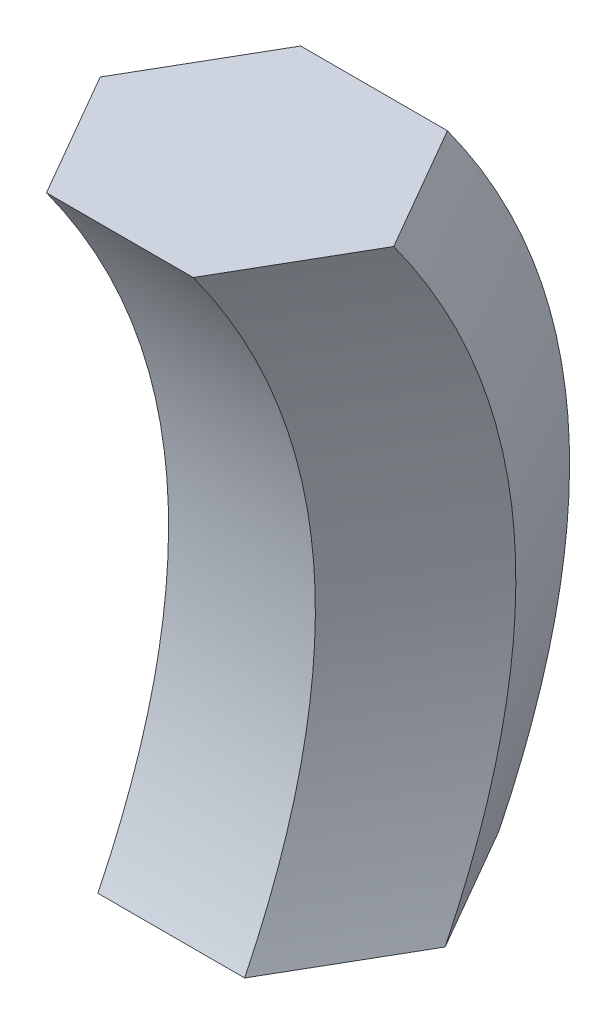
ISO-10303-21;
HEADER;
FILE_DESCRIPTION(('STEP AP214'),'2;1');
FILE_NAME('part.step','',(''),(''),'','','');
FILE_SCHEMA(('AUTOMOTIVE_DESIGN { 1 0 10303 214 1 1 1 1 }'));
ENDSEC;
DATA;
#1=APPLICATION_CONTEXT('core data for automotive mechanical design processes');
#2=APPLICATION_PROTOCOL_DEFINITION('international standard','automotive_design',2000,#1);
#3=PRODUCT_CONTEXT('',#1,'mechanical');
#4=PRODUCT('Part','Part','',(#3));
#5=PRODUCT_RELATED_PRODUCT_CATEGORY('part','',(#4));
#6=PRODUCT_DEFINITION_FORMATION('','',#4);
#7=PRODUCT_DEFINITION_CONTEXT('part definition',#1,'design');
#8=PRODUCT_DEFINITION('design','',#6,#7);
#9=PRODUCT_DEFINITION_SHAPE('','',#8);
#10=(LENGTH_UNIT() NAMED_UNIT(*) SI_UNIT(.MILLI.,.METRE.));
#11=(NAMED_UNIT(*) PLANE_ANGLE_UNIT() SI_UNIT($,.RADIAN.));
#12=(NAMED_UNIT(*) SI_UNIT($,.STERADIAN.) SOLID_ANGLE_UNIT());
#13=UNCERTAINTY_MEASURE_WITH_UNIT(LENGTH_MEASURE(1.E-05),#10,'distance_accuracy_value','');
#14=(GEOMETRIC_REPRESENTATION_CONTEXT(3) GLOBAL_UNCERTAINTY_ASSIGNED_CONTEXT((#13)) GLOBAL_UNIT_ASSIGNED_CONTEXT((#10,
#11,#12)) REPRESENTATION_CONTEXT('',''));
#15=CARTESIAN_POINT('',(0.,0.,0.));
#16=DIRECTION('',(0.,0.,1.));
#17=DIRECTION('',(1.,0.,0.));
#18=AXIS2_PLACEMENT_3D('',#15,#16,#17);
#19=CARTESIAN_POINT('',(0.,100.,0.));
#20=DIRECTION('',(0.,1.,0.));
#21=DIRECTION('',(0.,0.,1.));
#22=AXIS2_PLACEMENT_3D('',#19,#20,#21);
#23=PLANE('',#22);
#24=DIRECTION('',(0.5,0.,-0.866025403784439));
#25=VECTOR('',#24,1.);
#26=CARTESIAN_POINT('',(11.6047404107115,100.,28.2321956119478));
#27=LINE('',#26,#25);
#28=CARTESIAN_POINT('',(11.6047404107115,100.,28.2321956119478));
#29=VERTEX_POINT('',#28);
#30=CARTESIAN_POINT('',(23.2094808214229,100.,8.13219561194784));
#31=VERTEX_POINT('',#30);
#32=EDGE_CURVE('E504',#29,#31,#27,.T.);
#33=ORIENTED_EDGE('',*,*,#32,.T.);
#34=DIRECTION('',(-0.5,0.,-0.866025403784439));
#35=VECTOR('',#34,1.);
#36=CARTESIAN_POINT('',(23.2094808214229,100.,8.13219561194784));
#37=LINE('',#36,#35);
#38=CARTESIAN_POINT('',(11.6047404107115,100.,-11.9678043880522));
#39=VERTEX_POINT('',#38);
#40=EDGE_CURVE('E228',#31,#39,#37,.T.);
#41=ORIENTED_EDGE('',*,*,#40,.T.);
#42=DIRECTION('',(-1.,0.,0.));
#43=VECTOR('',#42,1.);
#44=CARTESIAN_POINT('',(11.6047404107115,100.,-11.9678043880522));
#45=LINE('',#44,#43);
#46=CARTESIAN_POINT('',(-11.6047404107115,100.,-11.9678043880522));
#47=VERTEX_POINT('',#46);
#48=EDGE_CURVE('E287',#39,#47,#45,.T.);
#49=ORIENTED_EDGE('',*,*,#48,.T.);
#50=DIRECTION('',(-0.5,0.,0.866025403784439));
#51=VECTOR('',#50,1.);
#52=CARTESIAN_POINT('',(-11.6047404107115,100.,-11.9678043880522));
#53=LINE('',#52,#51);
#54=CARTESIAN_POINT('',(-23.209480821423,100.,8.13219561194783));
#55=VERTEX_POINT('',#54);
#56=EDGE_CURVE('E301',#47,#55,#53,.T.);
#57=ORIENTED_EDGE('',*,*,#56,.T.);
#58=DIRECTION('',(0.5,0.,0.866025403784439));
#59=VECTOR('',#58,1.);
#60=CARTESIAN_POINT('',(-23.209480821423,100.,8.13219561194783));
#61=LINE('',#60,#59);
#62=CARTESIAN_POINT('',(-11.6047404107115,100.,28.2321956119478));
#63=VERTEX_POINT('',#62);
#64=EDGE_CURVE('E151',#55,#63,#61,.T.);
#65=ORIENTED_EDGE('',*,*,#64,.T.);
#66=DIRECTION('',(1.,0.,0.));
#67=VECTOR('',#66,1.);
#68=CARTESIAN_POINT('',(-11.6047404107115,100.,28.2321956119478));
#69=LINE('',#68,#67);
#70=EDGE_CURVE('E13',#63,#29,#69,.T.);
#71=ORIENTED_EDGE('',*,*,#70,.T.);
#72=EDGE_LOOP('',(#33,#41,#49,#57,#65,#71));
#73=FACE_BOUND('',#72,.T.);
#74=ADVANCED_FACE('F141',(#73),#23,.T.);
#75=CARTESIAN_POINT('',(0.,0.,0.));
#76=DIRECTION('',(0.,1.,0.));
#77=DIRECTION('',(0.,0.,1.));
#78=AXIS2_PLACEMENT_3D('',#75,#76,#77);
#79=PLANE('',#78);
#80=DIRECTION('',(0.5,0.,-0.866025403784439));
#81=VECTOR('',#80,1.);
#82=CARTESIAN_POINT('',(11.6047404107115,0.,20.1));
#83=LINE('',#82,#81);
#84=CARTESIAN_POINT('',(11.6047404107115,0.,20.1));
#85=VERTEX_POINT('',#84);
#86=CARTESIAN_POINT('',(23.209480821423,0.,0.));
#87=VERTEX_POINT('',#86);
#88=EDGE_CURVE('E202',#85,#87,#83,.T.);
#89=ORIENTED_EDGE('',*,*,#88,.F.);
#90=DIRECTION('',(1.,0.,0.));
#91=VECTOR('',#90,1.);
#92=CARTESIAN_POINT('',(-11.6047404107115,0.,20.1));
#93=LINE('',#92,#91);
#94=CARTESIAN_POINT('',(-11.6047404107115,0.,20.1));
#95=VERTEX_POINT('',#94);
#96=EDGE_CURVE('E344',#95,#85,#93,.T.);
#97=ORIENTED_EDGE('',*,*,#96,.F.);
#98=DIRECTION('',(0.5,0.,0.866025403784439));
#99=VECTOR('',#98,1.);
#100=CARTESIAN_POINT('',(-23.209480821423,0.,0.));
#101=LINE('',#100,#99);
#102=CARTESIAN_POINT('',(-23.209480821423,0.,0.));
#103=VERTEX_POINT('',#102);
#104=EDGE_CURVE('E354',#103,#95,#101,.T.);
#105=ORIENTED_EDGE('',*,*,#104,.F.);
#106=DIRECTION('',(-0.5,0.,0.866025403784439));
#107=VECTOR('',#106,1.);
#108=CARTESIAN_POINT('',(-11.6047404107115,0.,-20.1));
#109=LINE('',#108,#107);
#110=CARTESIAN_POINT('',(-11.6047404107115,0.,-20.1));
#111=VERTEX_POINT('',#110);
#112=EDGE_CURVE('E409',#111,#103,#109,.T.);
#113=ORIENTED_EDGE('',*,*,#112,.F.);
#114=DIRECTION('',(-1.,0.,0.));
#115=VECTOR('',#114,1.);
#116=CARTESIAN_POINT('',(11.6047404107115,0.,-20.1));
#117=LINE('',#116,#115);
#118=CARTESIAN_POINT('',(11.6047404107115,0.,-20.1));
#119=VERTEX_POINT('',#118);
#120=EDGE_CURVE('E205',#119,#111,#117,.T.);
#121=ORIENTED_EDGE('',*,*,#120,.F.);
#122=DIRECTION('',(-0.5,0.,-0.866025403784439));
#123=VECTOR('',#122,1.);
#124=CARTESIAN_POINT('',(23.209480821423,0.,0.));
#125=LINE('',#124,#123);
#126=EDGE_CURVE('E198',#87,#119,#125,.T.);
#127=ORIENTED_EDGE('',*,*,#126,.F.);
#128=EDGE_LOOP('',(#89,#97,#105,#113,#121,#127));
#129=FACE_BOUND('',#128,.T.);
#130=ADVANCED_FACE('F201',(#129),#79,.F.);
#131=CARTESIAN_POINT('',(11.6047404107115,0.,-20.1));
#132=CARTESIAN_POINT('',(11.6047404107112,35.3808590582085,-37.349024663102));
#133=CARTESIAN_POINT('',(11.6047404107112,68.7141923915418,-34.6382927924527));
#134=CARTESIAN_POINT('',(11.6047404107115,100.,-11.9678043880522));
#135=CARTESIAN_POINT('',(10.6376787098189,0.,-20.1));
#136=CARTESIAN_POINT('',(10.6376787098186,35.3808590582085,-37.349024663102));
#137=CARTESIAN_POINT('',(10.6376787098186,68.7141923915418,-34.6382927924527));
#138=CARTESIAN_POINT('',(10.6376787098189,100.,-11.9678043880522));
#139=CARTESIAN_POINT('',(8.70355530803362,0.,-20.1));
#140=CARTESIAN_POINT('',(8.70355530803333,35.3808590582084,-37.349024663102));
#141=CARTESIAN_POINT('',(8.70355530803333,68.7141923915417,-34.6382927924528));
#142=CARTESIAN_POINT('',(8.70355530803362,99.9999999999999,-11.9678043880522));
#143=CARTESIAN_POINT('',(5.80237020535573,0.,-20.1));
#144=CARTESIAN_POINT('',(5.80237020535544,35.3808590582085,-37.349024663102));
#145=CARTESIAN_POINT('',(5.80237020535544,68.7141923915419,-34.6382927924527));
#146=CARTESIAN_POINT('',(5.80237020535573,100.,-11.9678043880522));
#147=CARTESIAN_POINT('',(2.90118510267787,0.,-20.1));
#148=CARTESIAN_POINT('',(2.90118510267759,35.3808590582084,-37.349024663102));
#149=CARTESIAN_POINT('',(2.90118510267759,68.7141923915417,-34.6382927924528));
#150=CARTESIAN_POINT('',(2.90118510267788,99.9999999999998,-11.9678043880522));
#151=CARTESIAN_POINT('',(0.967061700892619,0.,-20.1));
#152=CARTESIAN_POINT('',(0.96706170089233,35.3808590582085,-37.349024663102));
#153=CARTESIAN_POINT('',(0.967061700892331,68.7141923915418,-34.6382927924528));
#154=CARTESIAN_POINT('',(0.96706170089262,100.,-11.9678043880522));
#155=CARTESIAN_POINT('',(-0.967061700892625,0.,-20.1));
#156=CARTESIAN_POINT('',(-0.967061700892913,35.3808590582085,-37.349024663102));
#157=CARTESIAN_POINT('',(-0.967061700892912,68.7141923915418,-34.6382927924528));
#158=CARTESIAN_POINT('',(-0.967061700892623,100.,-11.9678043880522));
#159=CARTESIAN_POINT('',(-2.90118510267787,0.,-20.1));
#160=CARTESIAN_POINT('',(-2.90118510267816,35.3808590582084,-37.349024663102));
#161=CARTESIAN_POINT('',(-2.90118510267816,68.7141923915418,-34.6382927924528));
#162=CARTESIAN_POINT('',(-2.90118510267787,99.9999999999999,-11.9678043880522));
#163=CARTESIAN_POINT('',(-5.80237020535574,0.,-20.1));
#164=CARTESIAN_POINT('',(-5.80237020535603,35.3808590582085,-37.349024663102));
#165=CARTESIAN_POINT('',(-5.80237020535602,68.7141923915419,-34.6382927924528));
#166=CARTESIAN_POINT('',(-5.80237020535573,100.,-11.9678043880522));
#167=CARTESIAN_POINT('',(-8.70355530803361,0.,-20.1));
#168=CARTESIAN_POINT('',(-8.7035553080339,35.3808590582084,-37.349024663102));
#169=CARTESIAN_POINT('',(-8.7035553080339,68.7141923915417,-34.6382927924528));
#170=CARTESIAN_POINT('',(-8.70355530803361,99.9999999999999,-11.9678043880522));
#171=CARTESIAN_POINT('',(-10.6376787098189,0.,-20.1));
#172=CARTESIAN_POINT('',(-10.6376787098191,35.3808590582085,-37.349024663102));
#173=CARTESIAN_POINT('',(-10.6376787098191,68.7141923915418,-34.6382927924528));
#174=CARTESIAN_POINT('',(-10.6376787098189,100.,-11.9678043880522));
#175=CARTESIAN_POINT('',(-11.6047404107115,0.,-20.1));
#176=CARTESIAN_POINT('',(-11.6047404107118,35.3808590582085,-37.349024663102));
#177=CARTESIAN_POINT('',(-11.6047404107118,68.7141923915418,-34.6382927924528));
#178=CARTESIAN_POINT('',(-11.6047404107115,100.,-11.9678043880522));
#179=B_SPLINE_SURFACE_WITH_KNOTS('',3,3,((#131,#132,#133,#134),(#135,#136,#137,#138),(#139,#140,
#141,#142),(#143,#144,#145,#146),(#147,#148,#149,#150),(#151,#152,#153,#154),(#155,#156,#157,
#158),(#159,#160,#161,#162),(#163,#164,#165,#166),(#167,#168,#169,#170),(#171,#172,#173,#174),
(#175,#176,#177,#178)),.UNSPECIFIED.,.F.,.F.,.F.,(4,1,1,1,2,1,1,1,4),(4,4),(0.833333333333333,
0.854166666666667,0.875,0.895833333333333,0.916666666666667,0.9375,0.958333333333333,
0.979166666666667,1.),(0.,1.),.UNSPECIFIED.);
#180=CARTESIAN_POINT('',(-11.6047404107115,0.,-20.1));
#181=CARTESIAN_POINT('',(-11.6047404107118,35.3808590582085,-37.349024663102));
#182=CARTESIAN_POINT('',(-11.6047404107118,68.7141923915418,-34.6382927924528));
#183=CARTESIAN_POINT('',(-11.6047404107115,100.,-11.9678043880522));
#184=B_SPLINE_CURVE_WITH_KNOTS('',3,(#180,#181,#182,#183),.UNSPECIFIED.,.F.,.F.,(4,4),(0.,1.),.UNSPECIFIED.);
#185=EDGE_CURVE('E232',#111,#47,#184,.T.);
#186=CARTESIAN_POINT('',(11.6047404107115,0.,-20.1));
#187=CARTESIAN_POINT('',(11.6047404107112,35.3808590582085,-37.349024663102));
#188=CARTESIAN_POINT('',(11.6047404107112,68.7141923915418,-34.6382927924527));
#189=CARTESIAN_POINT('',(11.6047404107115,100.,-11.9678043880522));
#190=B_SPLINE_CURVE_WITH_KNOTS('',3,(#186,#187,#188,#189),.UNSPECIFIED.,.F.,.F.,(4,4),(0.,1.),.UNSPECIFIED.);
#191=EDGE_CURVE('E230',#119,#39,#190,.T.);
#192=ORIENTED_EDGE('',*,*,#120,.T.);
#193=ORIENTED_EDGE('',*,*,#185,.T.);
#194=ORIENTED_EDGE('',*,*,#48,.F.);
#195=ORIENTED_EDGE('',*,*,#191,.F.);
#196=EDGE_LOOP('',(#192,#193,#194,#195));
#197=FACE_BOUND('',#196,.T.);
#198=ADVANCED_FACE('F259',(#197),#179,.T.);
#199=CARTESIAN_POINT('',(23.209480821423,0.,0.));
#200=CARTESIAN_POINT('',(23.2094808214227,35.3808590582085,-17.249024663102));
#201=CARTESIAN_POINT('',(23.2094808214227,68.7141923915418,-14.5382927924527));
#202=CARTESIAN_POINT('',(23.2094808214229,100.,8.13219561194784));
#203=CARTESIAN_POINT('',(22.2424191205303,0.,-1.675));
#204=CARTESIAN_POINT('',(22.24241912053,35.3808590582085,-18.924024663102));
#205=CARTESIAN_POINT('',(22.24241912053,68.7141923915418,-16.2132927924528));
#206=CARTESIAN_POINT('',(22.2424191205303,100.,6.45719561194784));
#207=CARTESIAN_POINT('',(20.3082957187451,0.,-5.025));
#208=CARTESIAN_POINT('',(20.3082957187448,35.3808590582085,-22.274024663102));
#209=CARTESIAN_POINT('',(20.3082957187448,68.7141923915419,-19.5632927924527));
#210=CARTESIAN_POINT('',(20.3082957187451,100.,3.10719561194784));
#211=CARTESIAN_POINT('',(17.4071106160672,0.,-10.05));
#212=CARTESIAN_POINT('',(17.4071106160669,35.3808590582084,-27.299024663102));
#213=CARTESIAN_POINT('',(17.4071106160669,68.7141923915417,-24.5882927924527));
#214=CARTESIAN_POINT('',(17.4071106160672,99.9999999999999,-1.91780438805216));
#215=CARTESIAN_POINT('',(14.5059255133893,0.,-15.075));
#216=CARTESIAN_POINT('',(14.5059255133891,35.3808590582085,-32.324024663102));
#217=CARTESIAN_POINT('',(14.5059255133891,68.7141923915418,-29.6132927924528));
#218=CARTESIAN_POINT('',(14.5059255133893,100.,-6.94280438805217));
#219=CARTESIAN_POINT('',(12.5718021116041,0.,-18.425));
#220=CARTESIAN_POINT('',(12.5718021116038,35.3808590582085,-35.674024663102));
#221=CARTESIAN_POINT('',(12.5718021116038,68.7141923915418,-32.9632927924527));
#222=CARTESIAN_POINT('',(12.5718021116041,100.,-10.2928043880522));
#223=CARTESIAN_POINT('',(11.6047404107115,0.,-20.1));
#224=CARTESIAN_POINT('',(11.6047404107112,35.3808590582085,-37.349024663102));
#225=CARTESIAN_POINT('',(11.6047404107112,68.7141923915418,-34.6382927924527));
#226=CARTESIAN_POINT('',(11.6047404107115,100.,-11.9678043880522));
#227=B_SPLINE_SURFACE_WITH_KNOTS('',3,3,((#199,#200,#201,#202),(#203,#204,#205,#206),(#207,#208,
#209,#210),(#211,#212,#213,#214),(#215,#216,#217,#218),(#219,#220,#221,#222),(#223,#224,#225,
#226)),.UNSPECIFIED.,.F.,.F.,.F.,(4,1,1,1,4),(4,4),(0.666666666666667,0.708333333333333,0.75,
0.791666666666667,0.833333333333333),(0.,1.),.UNSPECIFIED.);
#228=CARTESIAN_POINT('',(23.209480821423,0.,0.));
#229=CARTESIAN_POINT('',(23.2094808214227,35.3808590582085,-17.249024663102));
#230=CARTESIAN_POINT('',(23.2094808214227,68.7141923915418,-14.5382927924527));
#231=CARTESIAN_POINT('',(23.2094808214229,100.,8.13219561194784));
#232=B_SPLINE_CURVE_WITH_KNOTS('',3,(#228,#229,#230,#231),.UNSPECIFIED.,.F.,.F.,(4,4),(0.,1.),.UNSPECIFIED.);
#233=EDGE_CURVE('E219',#87,#31,#232,.T.);
#234=ORIENTED_EDGE('',*,*,#126,.T.);
#235=ORIENTED_EDGE('',*,*,#191,.T.);
#236=ORIENTED_EDGE('',*,*,#40,.F.);
#237=ORIENTED_EDGE('',*,*,#233,.F.);
#238=EDGE_LOOP('',(#234,#235,#236,#237));
#239=FACE_BOUND('',#238,.T.);
#240=ADVANCED_FACE('F226',(#239),#227,.T.);
#241=CARTESIAN_POINT('',(11.6047404107115,0.,20.1));
#242=CARTESIAN_POINT('',(11.6047404107112,35.3808590582085,2.85097533689798));
#243=CARTESIAN_POINT('',(11.6047404107112,68.7141923915418,5.56170720754726));
#244=CARTESIAN_POINT('',(11.6047404107115,100.,28.2321956119478));
#245=CARTESIAN_POINT('',(12.5718021116041,0.,18.425));
#246=CARTESIAN_POINT('',(12.5718021116038,35.3808590582085,1.17597533689798));
#247=CARTESIAN_POINT('',(12.5718021116038,68.7141923915418,3.88670720754726));
#248=CARTESIAN_POINT('',(12.5718021116041,100.,26.5571956119478));
#249=CARTESIAN_POINT('',(14.5059255133893,0.,15.075));
#250=CARTESIAN_POINT('',(14.5059255133891,35.3808590582085,-2.17402466310201));
#251=CARTESIAN_POINT('',(14.5059255133891,68.7141923915419,0.536707207547255));
#252=CARTESIAN_POINT('',(14.5059255133894,100.,23.2071956119478));
#253=CARTESIAN_POINT('',(17.4071106160672,0.,10.05));
#254=CARTESIAN_POINT('',(17.4071106160669,35.3808590582084,-7.19902466310203));
#255=CARTESIAN_POINT('',(17.4071106160669,68.7141923915417,-4.48829279245275));
#256=CARTESIAN_POINT('',(17.4071106160672,99.9999999999999,18.1821956119478));
#257=CARTESIAN_POINT('',(20.3082957187451,0.,5.02500000000001));
#258=CARTESIAN_POINT('',(20.3082957187448,35.3808590582085,-12.224024663102));
#259=CARTESIAN_POINT('',(20.3082957187448,68.7141923915418,-9.51329279245274));
#260=CARTESIAN_POINT('',(20.3082957187451,100.,13.1571956119478));
#261=CARTESIAN_POINT('',(22.2424191205303,0.,1.675));
#262=CARTESIAN_POINT('',(22.24241912053,35.3808590582085,-15.574024663102));
#263=CARTESIAN_POINT('',(22.24241912053,68.7141923915418,-12.8632927924527));
#264=CARTESIAN_POINT('',(22.2424191205303,100.,9.80719561194784));
#265=CARTESIAN_POINT('',(23.209480821423,0.,0.));
#266=CARTESIAN_POINT('',(23.2094808214227,35.3808590582085,-17.249024663102));
#267=CARTESIAN_POINT('',(23.2094808214227,68.7141923915418,-14.5382927924527));
#268=CARTESIAN_POINT('',(23.2094808214229,100.,8.13219561194784));
#269=B_SPLINE_SURFACE_WITH_KNOTS('',3,3,((#241,#242,#243,#244),(#245,#246,#247,#248),(#249,#250,
#251,#252),(#253,#254,#255,#256),(#257,#258,#259,#260),(#261,#262,#263,#264),(#265,#266,#267,
#268)),.UNSPECIFIED.,.F.,.F.,.F.,(4,1,1,1,4),(4,4),(0.5,0.541666666666667,0.583333333333333,
0.625,0.666666666666667),(0.,1.),.UNSPECIFIED.);
#270=CARTESIAN_POINT('',(11.6047404107115,0.,20.1));
#271=CARTESIAN_POINT('',(11.6047404107112,35.3808590582085,2.85097533689798));
#272=CARTESIAN_POINT('',(11.6047404107112,68.7141923915418,5.56170720754726));
#273=CARTESIAN_POINT('',(11.6047404107115,100.,28.2321956119478));
#274=B_SPLINE_CURVE_WITH_KNOTS('',3,(#270,#271,#272,#273),.UNSPECIFIED.,.F.,.F.,(4,4),(0.,1.),.UNSPECIFIED.);
#275=EDGE_CURVE('E221',#85,#29,#274,.T.);
#276=ORIENTED_EDGE('',*,*,#88,.T.);
#277=ORIENTED_EDGE('',*,*,#233,.T.);
#278=ORIENTED_EDGE('',*,*,#32,.F.);
#279=ORIENTED_EDGE('',*,*,#275,.F.);
#280=EDGE_LOOP('',(#276,#277,#278,#279));
#281=FACE_BOUND('',#280,.T.);
#282=ADVANCED_FACE('F218',(#281),#269,.T.);
#283=CARTESIAN_POINT('',(-11.6047404107115,0.,20.1));
#284=CARTESIAN_POINT('',(-11.6047404107118,35.3808590582085,2.85097533689797));
#285=CARTESIAN_POINT('',(-11.6047404107118,68.7141923915418,5.56170720754725));
#286=CARTESIAN_POINT('',(-11.6047404107115,100.,28.2321956119478));
#287=CARTESIAN_POINT('',(-9.67061700892624,0.,20.1));
#288=CARTESIAN_POINT('',(-9.67061700892653,35.3808590582085,2.85097533689797));
#289=CARTESIAN_POINT('',(-9.67061700892653,68.7141923915418,5.56170720754725));
#290=CARTESIAN_POINT('',(-9.67061700892624,100.,28.2321956119478));
#291=CARTESIAN_POINT('',(-5.80237020535576,0.,20.1));
#292=CARTESIAN_POINT('',(-5.80237020535604,35.3808590582085,2.85097533689801));
#293=CARTESIAN_POINT('',(-5.80237020535604,68.7141923915418,5.56170720754727));
#294=CARTESIAN_POINT('',(-5.80237020535575,100.,28.2321956119478));
#295=CARTESIAN_POINT('',(0.,0.,20.1));
#296=CARTESIAN_POINT('',(-2.93985966284675E-13,35.3808590582085,2.85097533689795));
#297=CARTESIAN_POINT('',(-2.94528067370917E-13,68.7141923915418,5.56170720754723));
#298=CARTESIAN_POINT('',(0.,100.,28.2321956119478));
#299=CARTESIAN_POINT('',(5.80237020535573,0.,20.1));
#300=CARTESIAN_POINT('',(5.80237020535544,35.3808590582084,2.85097533689801));
#301=CARTESIAN_POINT('',(5.80237020535544,68.7141923915418,5.56170720754728));
#302=CARTESIAN_POINT('',(5.80237020535573,99.9999999999999,28.2321956119479));
#303=CARTESIAN_POINT('',(9.67061700892622,0.,20.1));
#304=CARTESIAN_POINT('',(9.67061700892593,35.3808590582085,2.85097533689798));
#305=CARTESIAN_POINT('',(9.67061700892593,68.7141923915418,5.56170720754726));
#306=CARTESIAN_POINT('',(9.67061700892622,100.,28.2321956119478));
#307=CARTESIAN_POINT('',(11.6047404107115,0.,20.1));
#308=CARTESIAN_POINT('',(11.6047404107112,35.3808590582085,2.85097533689798));
#309=CARTESIAN_POINT('',(11.6047404107112,68.7141923915418,5.56170720754726));
#310=CARTESIAN_POINT('',(11.6047404107115,100.,28.2321956119478));
#311=B_SPLINE_SURFACE_WITH_KNOTS('',3,3,((#283,#284,#285,#286),(#287,#288,#289,#290),(#291,#292,
#293,#294),(#295,#296,#297,#298),(#299,#300,#301,#302),(#303,#304,#305,#306),(#307,#308,#309,
#310)),.UNSPECIFIED.,.F.,.F.,.F.,(4,1,1,1,4),(4,4),(0.333333333333333,0.375,0.416666666666667,
0.458333333333333,0.5),(0.,1.),.UNSPECIFIED.);
#312=CARTESIAN_POINT('',(-11.6047404107115,0.,20.1));
#313=CARTESIAN_POINT('',(-11.6047404107118,35.3808590582085,2.85097533689797));
#314=CARTESIAN_POINT('',(-11.6047404107118,68.7141923915418,5.56170720754725));
#315=CARTESIAN_POINT('',(-11.6047404107115,100.,28.2321956119478));
#316=B_SPLINE_CURVE_WITH_KNOTS('',3,(#312,#313,#314,#315),.UNSPECIFIED.,.F.,.F.,(4,4),(0.,1.),.UNSPECIFIED.);
#317=EDGE_CURVE('E166',#95,#63,#316,.T.);
#318=ORIENTED_EDGE('',*,*,#96,.T.);
#319=ORIENTED_EDGE('',*,*,#275,.T.);
#320=ORIENTED_EDGE('',*,*,#70,.F.);
#321=ORIENTED_EDGE('',*,*,#317,.F.);
#322=EDGE_LOOP('',(#318,#319,#320,#321));
#323=FACE_BOUND('',#322,.T.);
#324=ADVANCED_FACE('F368',(#323),#311,.T.);
#325=CARTESIAN_POINT('',(-23.209480821423,0.,0.));
#326=CARTESIAN_POINT('',(-23.2094808214232,35.3808590582085,-17.249024663102));
#327=CARTESIAN_POINT('',(-23.2094808214232,68.7141923915418,-14.5382927924528));
#328=CARTESIAN_POINT('',(-23.209480821423,100.,8.13219561194783));
#329=CARTESIAN_POINT('',(-22.2424191205303,0.,1.67499999999999));
#330=CARTESIAN_POINT('',(-22.2424191205306,35.3808590582085,-15.574024663102));
#331=CARTESIAN_POINT('',(-22.2424191205306,68.7141923915418,-12.8632927924528));
#332=CARTESIAN_POINT('',(-22.2424191205303,100.,9.80719561194783));
#333=CARTESIAN_POINT('',(-20.3082957187451,0.,5.02499999999999));
#334=CARTESIAN_POINT('',(-20.3082957187454,35.3808590582085,-12.224024663102));
#335=CARTESIAN_POINT('',(-20.3082957187454,68.7141923915419,-9.51329279245276));
#336=CARTESIAN_POINT('',(-20.3082957187451,100.,13.1571956119478));
#337=CARTESIAN_POINT('',(-17.4071106160672,0.,10.05));
#338=CARTESIAN_POINT('',(-17.4071106160675,35.3808590582084,-7.19902466310203));
#339=CARTESIAN_POINT('',(-17.4071106160675,68.7141923915417,-4.48829279245274));
#340=CARTESIAN_POINT('',(-17.4071106160672,99.9999999999998,18.1821956119479));
#341=CARTESIAN_POINT('',(-14.5059255133894,0.,15.075));
#342=CARTESIAN_POINT('',(-14.5059255133896,35.3808590582085,-2.17402466310202));
#343=CARTESIAN_POINT('',(-14.5059255133896,68.7141923915419,0.536707207547251));
#344=CARTESIAN_POINT('',(-14.5059255133893,100.,23.2071956119478));
#345=CARTESIAN_POINT('',(-12.5718021116041,0.,18.425));
#346=CARTESIAN_POINT('',(-12.5718021116044,35.3808590582085,1.17597533689797));
#347=CARTESIAN_POINT('',(-12.5718021116044,68.7141923915418,3.88670720754725));
#348=CARTESIAN_POINT('',(-12.5718021116041,100.,26.5571956119478));
#349=CARTESIAN_POINT('',(-11.6047404107115,0.,20.1));
#350=CARTESIAN_POINT('',(-11.6047404107118,35.3808590582085,2.85097533689797));
#351=CARTESIAN_POINT('',(-11.6047404107118,68.7141923915418,5.56170720754725));
#352=CARTESIAN_POINT('',(-11.6047404107115,100.,28.2321956119478));
#353=B_SPLINE_SURFACE_WITH_KNOTS('',3,3,((#325,#326,#327,#328),(#329,#330,#331,#332),(#333,#334,
#335,#336),(#337,#338,#339,#340),(#341,#342,#343,#344),(#345,#346,#347,#348),(#349,#350,#351,
#352)),.UNSPECIFIED.,.F.,.F.,.F.,(4,1,1,1,4),(4,4),(0.166666666666667,0.208333333333333,0.25,
0.291666666666667,0.333333333333333),(0.,1.),.UNSPECIFIED.);
#354=CARTESIAN_POINT('',(-23.209480821423,0.,0.));
#355=CARTESIAN_POINT('',(-23.2094808214232,35.3808590582085,-17.249024663102));
#356=CARTESIAN_POINT('',(-23.2094808214232,68.7141923915418,-14.5382927924528));
#357=CARTESIAN_POINT('',(-23.209480821423,100.,8.13219561194783));
#358=B_SPLINE_CURVE_WITH_KNOTS('',3,(#354,#355,#356,#357),.UNSPECIFIED.,.F.,.F.,(4,4),(0.,1.),.UNSPECIFIED.);
#359=EDGE_CURVE('E337',#103,#55,#358,.T.);
#360=ORIENTED_EDGE('',*,*,#104,.T.);
#361=ORIENTED_EDGE('',*,*,#317,.T.);
#362=ORIENTED_EDGE('',*,*,#64,.F.);
#363=ORIENTED_EDGE('',*,*,#359,.F.);
#364=EDGE_LOOP('',(#360,#361,#362,#363));
#365=FACE_BOUND('',#364,.T.);
#366=ADVANCED_FACE('F319',(#365),#353,.T.);
#367=CARTESIAN_POINT('',(-11.6047404107115,0.,-20.1));
#368=CARTESIAN_POINT('',(-11.6047404107118,35.3808590582085,-37.349024663102));
#369=CARTESIAN_POINT('',(-11.6047404107118,68.7141923915418,-34.6382927924528));
#370=CARTESIAN_POINT('',(-11.6047404107115,100.,-11.9678043880522));
#371=CARTESIAN_POINT('',(-12.5718021116041,0.,-18.425));
#372=CARTESIAN_POINT('',(-12.5718021116044,35.3808590582085,-35.674024663102));
#373=CARTESIAN_POINT('',(-12.5718021116044,68.7141923915418,-32.9632927924528));
#374=CARTESIAN_POINT('',(-12.5718021116041,100.,-10.2928043880522));
#375=CARTESIAN_POINT('',(-14.5059255133894,0.,-15.075));
#376=CARTESIAN_POINT('',(-14.5059255133896,35.3808590582085,-32.324024663102));
#377=CARTESIAN_POINT('',(-14.5059255133896,68.7141923915419,-29.6132927924528));
#378=CARTESIAN_POINT('',(-14.5059255133894,100.,-6.94280438805217));
#379=CARTESIAN_POINT('',(-17.4071106160672,0.,-10.05));
#380=CARTESIAN_POINT('',(-17.4071106160675,35.3808590582084,-27.299024663102));
#381=CARTESIAN_POINT('',(-17.4071106160675,68.7141923915417,-24.5882927924528));
#382=CARTESIAN_POINT('',(-17.4071106160672,99.9999999999999,-1.91780438805216));
#383=CARTESIAN_POINT('',(-20.3082957187451,0.,-5.025));
#384=CARTESIAN_POINT('',(-20.3082957187454,35.3808590582085,-22.274024663102));
#385=CARTESIAN_POINT('',(-20.3082957187454,68.7141923915418,-19.5632927924528));
#386=CARTESIAN_POINT('',(-20.3082957187451,100.,3.10719561194783));
#387=CARTESIAN_POINT('',(-22.2424191205303,0.,-1.67500000000001));
#388=CARTESIAN_POINT('',(-22.2424191205306,35.3808590582085,-18.924024663102));
#389=CARTESIAN_POINT('',(-22.2424191205306,68.7141923915418,-16.2132927924528));
#390=CARTESIAN_POINT('',(-22.2424191205303,100.,6.45719561194784));
#391=CARTESIAN_POINT('',(-23.209480821423,0.,0.));
#392=CARTESIAN_POINT('',(-23.2094808214232,35.3808590582085,-17.249024663102));
#393=CARTESIAN_POINT('',(-23.2094808214232,68.7141923915418,-14.5382927924528));
#394=CARTESIAN_POINT('',(-23.209480821423,100.,8.13219561194783));
#395=B_SPLINE_SURFACE_WITH_KNOTS('',3,3,((#367,#368,#369,#370),(#371,#372,#373,#374),(#375,#376,
#377,#378),(#379,#380,#381,#382),(#383,#384,#385,#386),(#387,#388,#389,#390),(#391,#392,#393,
#394)),.UNSPECIFIED.,.F.,.F.,.F.,(4,1,1,1,4),(4,4),(0.,0.0416666666666667,0.0833333333333334,
0.125,0.166666666666667),(0.,1.),.UNSPECIFIED.);
#396=ORIENTED_EDGE('',*,*,#112,.T.);
#397=ORIENTED_EDGE('',*,*,#359,.T.);
#398=ORIENTED_EDGE('',*,*,#56,.F.);
#399=ORIENTED_EDGE('',*,*,#185,.F.);
#400=EDGE_LOOP('',(#396,#397,#398,#399));
#401=FACE_BOUND('',#400,.T.);
#402=ADVANCED_FACE('F307',(#401),#395,.T.);
#403=CLOSED_SHELL('',(#74,#130,#198,#240,#282,#324,#366,#402));
#404=MANIFOLD_SOLID_BREP('B2',#403);
#405=ADVANCED_BREP_SHAPE_REPRESENTATION('',(#18,#404),#14);
#406=SHAPE_DEFINITION_REPRESENTATION(#9,#405);
ENDSEC;
END-ISO-10303-21;
